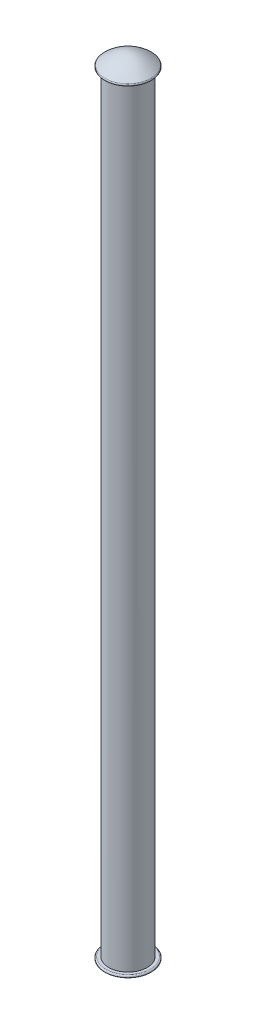
ISO-10303-21;
HEADER;
FILE_DESCRIPTION(('STEP AP214'),'2;1');
FILE_NAME('part.step','',(''),(''),'','','');
FILE_SCHEMA(('AUTOMOTIVE_DESIGN { 1 0 10303 214 1 1 1 1 }'));
ENDSEC;
DATA;
#1=APPLICATION_CONTEXT('core data for automotive mechanical design processes');
#2=APPLICATION_PROTOCOL_DEFINITION('international standard','automotive_design',2000,#1);
#3=PRODUCT_CONTEXT('',#1,'mechanical');
#4=PRODUCT('Part','Part','',(#3));
#5=PRODUCT_RELATED_PRODUCT_CATEGORY('part','',(#4));
#6=PRODUCT_DEFINITION_FORMATION('','',#4);
#7=PRODUCT_DEFINITION_CONTEXT('part definition',#1,'design');
#8=PRODUCT_DEFINITION('design','',#6,#7);
#9=PRODUCT_DEFINITION_SHAPE('','',#8);
#10=(LENGTH_UNIT() NAMED_UNIT(*) SI_UNIT(.MILLI.,.METRE.));
#11=(NAMED_UNIT(*) PLANE_ANGLE_UNIT() SI_UNIT($,.RADIAN.));
#12=(NAMED_UNIT(*) SI_UNIT($,.STERADIAN.) SOLID_ANGLE_UNIT());
#13=UNCERTAINTY_MEASURE_WITH_UNIT(LENGTH_MEASURE(1.E-05),#10,'distance_accuracy_value','');
#14=(GEOMETRIC_REPRESENTATION_CONTEXT(3) GLOBAL_UNCERTAINTY_ASSIGNED_CONTEXT((#13)) GLOBAL_UNIT_ASSIGNED_CONTEXT((#10,
#11,#12)) REPRESENTATION_CONTEXT('',''));
#15=CARTESIAN_POINT('',(0.,0.,0.));
#16=DIRECTION('',(0.,0.,1.));
#17=DIRECTION('',(1.,0.,0.));
#18=AXIS2_PLACEMENT_3D('',#15,#16,#17);
#19=CARTESIAN_POINT('',(0.,30.,0.));
#20=DIRECTION('',(0.,-1.,0.));
#21=DIRECTION('',(0.,0.,-1.));
#22=AXIS2_PLACEMENT_3D('',#19,#20,#21);
#23=CYLINDRICAL_SURFACE('',#22,1.5);
#24=CARTESIAN_POINT('',(0.,30.,0.));
#25=DIRECTION('',(0.,1.,0.));
#26=DIRECTION('',(0.,0.,1.));
#27=AXIS2_PLACEMENT_3D('',#24,#25,#26);
#28=CIRCLE('',#27,1.5);
#29=CARTESIAN_POINT('',(0.,30.,1.5));
#30=VERTEX_POINT('',#29);
#31=EDGE_CURVE('E11',#30,#30,#28,.T.);
#32=ORIENTED_EDGE('',*,*,#31,.F.);
#33=EDGE_LOOP('',(#32));
#34=FACE_BOUND('',#33,.T.);
#35=CARTESIAN_POINT('',(0.,-30.,0.));
#36=DIRECTION('',(0.,1.,0.));
#37=DIRECTION('',(-1.,0.,0.));
#38=AXIS2_PLACEMENT_3D('',#35,#36,#37);
#39=CIRCLE('',#38,1.5);
#40=CARTESIAN_POINT('',(-1.5,-30.,0.));
#41=VERTEX_POINT('',#40);
#42=EDGE_CURVE('E76',#41,#41,#39,.T.);
#43=ORIENTED_EDGE('',*,*,#42,.T.);
#44=EDGE_LOOP('',(#43));
#45=FACE_BOUND('',#44,.T.);
#46=ADVANCED_FACE('F34',(#34,#45),#23,.T.);
#47=CARTESIAN_POINT('',(0.,31.,0.));
#48=CARTESIAN_POINT('',(-0.657911989108993,31.,0.));
#49=CARTESIAN_POINT('',(-1.29697261417565,30.5791609249618,0.));
#50=CARTESIAN_POINT('',(-1.7943409140628,30.1778234053196,0.));
#51=B_SPLINE_CURVE_WITH_KNOTS('',3,(#47,#48,#49,#50),.UNSPECIFIED.,.F.,.F.,(4,4),(0.,1.),.UNSPECIFIED.);
#52=CARTESIAN_POINT('',(0.,31.,0.));
#53=DIRECTION('',(0.,1.,0.));
#54=AXIS1_PLACEMENT('',#52,#53);
#55=SURFACE_OF_REVOLUTION('',#51,#54);
#56=CARTESIAN_POINT('',(0.,30.1778234053196,0.));
#57=DIRECTION('',(0.,1.,0.));
#58=DIRECTION('',(-1.,0.,0.));
#59=AXIS2_PLACEMENT_3D('',#56,#57,#58);
#60=CIRCLE('',#59,1.7943409140628);
#61=CARTESIAN_POINT('',(-1.7943409140628,30.1778234053196,0.));
#62=VERTEX_POINT('',#61);
#63=EDGE_CURVE('E41',#62,#62,#60,.T.);
#64=ORIENTED_EDGE('',*,*,#63,.T.);
#65=EDGE_LOOP('',(#64));
#66=FACE_BOUND('',#65,.T.);
#67=CARTESIAN_POINT('',(0.,31.,0.));
#68=VERTEX_POINT('',#67);
#69=VERTEX_LOOP('',#68);
#70=FACE_BOUND('',#69,.T.);
#71=ADVANCED_FACE('F66',(#66,#70),#55,.F.);
#72=CARTESIAN_POINT('',(0.,30.1,0.));
#73=DIRECTION('',(0.,1.,0.));
#74=DIRECTION('',(-1.,0.,0.));
#75=AXIS2_PLACEMENT_3D('',#72,#73,#74);
#76=TOROIDAL_SURFACE('',#75,1.73154348111794,0.0999999999999966);
#77=CARTESIAN_POINT('',(0.,30.,0.));
#78=DIRECTION('',(0.,1.,0.));
#79=DIRECTION('',(-1.,0.,0.));
#80=AXIS2_PLACEMENT_3D('',#77,#78,#79);
#81=CIRCLE('',#80,1.73154348111794);
#82=CARTESIAN_POINT('',(-1.73154348111794,30.,0.));
#83=VERTEX_POINT('',#82);
#84=EDGE_CURVE('E78',#83,#83,#81,.T.);
#85=ORIENTED_EDGE('',*,*,#84,.T.);
#86=EDGE_LOOP('',(#85));
#87=FACE_BOUND('',#86,.T.);
#88=ORIENTED_EDGE('',*,*,#63,.F.);
#89=EDGE_LOOP('',(#88));
#90=FACE_BOUND('',#89,.T.);
#91=ADVANCED_FACE('F60',(#87,#90),#76,.T.);
#92=CARTESIAN_POINT('',(0.,30.,0.));
#93=DIRECTION('',(0.,-1.,0.));
#94=DIRECTION('',(1.,0.,0.));
#95=AXIS2_PLACEMENT_3D('',#92,#93,#94);
#96=PLANE('',#95);
#97=ORIENTED_EDGE('',*,*,#31,.T.);
#98=EDGE_LOOP('',(#97));
#99=FACE_BOUND('',#98,.T.);
#100=ORIENTED_EDGE('',*,*,#84,.F.);
#101=EDGE_LOOP('',(#100));
#102=FACE_BOUND('',#101,.T.);
#103=ADVANCED_FACE('F50',(#99,#102),#96,.T.);
#104=CARTESIAN_POINT('',(0.,-31.,0.));
#105=CARTESIAN_POINT('',(-0.657911989108993,-31.,0.));
#106=CARTESIAN_POINT('',(-1.29697261417565,-30.5791609249618,0.));
#107=CARTESIAN_POINT('',(-1.7943409140628,-30.1778234053196,0.));
#108=B_SPLINE_CURVE_WITH_KNOTS('',3,(#104,#105,#106,#107),.UNSPECIFIED.,.F.,.F.,(4,4),(0.,1.),.UNSPECIFIED.);
#109=CARTESIAN_POINT('',(0.,-31.,0.));
#110=DIRECTION('',(0.,-1.,0.));
#111=AXIS1_PLACEMENT('',#109,#110);
#112=SURFACE_OF_REVOLUTION('',#108,#111);
#113=CARTESIAN_POINT('',(0.,-30.1778234053196,0.));
#114=DIRECTION('',(0.,1.,0.));
#115=DIRECTION('',(-1.,0.,0.));
#116=AXIS2_PLACEMENT_3D('',#113,#114,#115);
#117=CIRCLE('',#116,1.7943409140628);
#118=CARTESIAN_POINT('',(-1.7943409140628,-30.1778234053196,0.));
#119=VERTEX_POINT('',#118);
#120=EDGE_CURVE('E79',#119,#119,#117,.T.);
#121=ORIENTED_EDGE('',*,*,#120,.F.);
#122=EDGE_LOOP('',(#121));
#123=FACE_BOUND('',#122,.T.);
#124=CARTESIAN_POINT('',(0.,-31.,0.));
#125=VERTEX_POINT('',#124);
#126=VERTEX_LOOP('',#125);
#127=FACE_BOUND('',#126,.T.);
#128=ADVANCED_FACE('F47',(#123,#127),#112,.F.);
#129=CARTESIAN_POINT('',(0.,-30.1,0.));
#130=DIRECTION('',(0.,-1.,0.));
#131=DIRECTION('',(-1.,0.,0.));
#132=AXIS2_PLACEMENT_3D('',#129,#130,#131);
#133=TOROIDAL_SURFACE('',#132,1.73154348111794,0.0999999999999966);
#134=CARTESIAN_POINT('',(0.,-30.,0.));
#135=DIRECTION('',(0.,1.,0.));
#136=DIRECTION('',(-1.,0.,0.));
#137=AXIS2_PLACEMENT_3D('',#134,#135,#136);
#138=CIRCLE('',#137,1.73154348111794);
#139=CARTESIAN_POINT('',(-1.73154348111794,-30.,0.));
#140=VERTEX_POINT('',#139);
#141=EDGE_CURVE('E84',#140,#140,#138,.T.);
#142=ORIENTED_EDGE('',*,*,#141,.F.);
#143=EDGE_LOOP('',(#142));
#144=FACE_BOUND('',#143,.T.);
#145=ORIENTED_EDGE('',*,*,#120,.T.);
#146=EDGE_LOOP('',(#145));
#147=FACE_BOUND('',#146,.T.);
#148=ADVANCED_FACE('F49',(#144,#147),#133,.T.);
#149=CARTESIAN_POINT('',(0.,-30.,0.));
#150=DIRECTION('',(0.,1.,0.));
#151=DIRECTION('',(1.,0.,0.));
#152=AXIS2_PLACEMENT_3D('',#149,#150,#151);
#153=PLANE('',#152);
#154=ORIENTED_EDGE('',*,*,#42,.F.);
#155=EDGE_LOOP('',(#154));
#156=FACE_BOUND('',#155,.T.);
#157=ORIENTED_EDGE('',*,*,#141,.T.);
#158=EDGE_LOOP('',(#157));
#159=FACE_BOUND('',#158,.T.);
#160=ADVANCED_FACE('F57',(#156,#159),#153,.T.);
#161=CLOSED_SHELL('',(#46,#71,#91,#103,#128,#148,#160));
#162=MANIFOLD_SOLID_BREP('B2',#161);
#163=ADVANCED_BREP_SHAPE_REPRESENTATION('',(#18,#162),#14);
#164=SHAPE_DEFINITION_REPRESENTATION(#9,#163);
ENDSEC;
END-ISO-10303-21;
